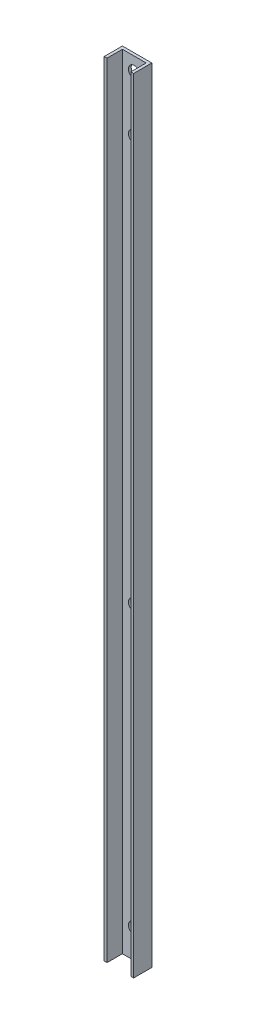
ISO-10303-21;
HEADER;
FILE_DESCRIPTION(('STEP AP214'),'2;1');
FILE_NAME('part.step','',(''),(''),'','','');
FILE_SCHEMA(('AUTOMOTIVE_DESIGN { 1 0 10303 214 1 1 1 1 }'));
ENDSEC;
DATA;
#1=APPLICATION_CONTEXT('core data for automotive mechanical design processes');
#2=APPLICATION_PROTOCOL_DEFINITION('international standard','automotive_design',2000,#1);
#3=PRODUCT_CONTEXT('',#1,'mechanical');
#4=PRODUCT('Part','Part','',(#3));
#5=PRODUCT_RELATED_PRODUCT_CATEGORY('part','',(#4));
#6=PRODUCT_DEFINITION_FORMATION('','',#4);
#7=PRODUCT_DEFINITION_CONTEXT('part definition',#1,'design');
#8=PRODUCT_DEFINITION('design','',#6,#7);
#9=PRODUCT_DEFINITION_SHAPE('','',#8);
#10=(LENGTH_UNIT() NAMED_UNIT(*) SI_UNIT(.MILLI.,.METRE.));
#11=(NAMED_UNIT(*) PLANE_ANGLE_UNIT() SI_UNIT($,.RADIAN.));
#12=(NAMED_UNIT(*) SI_UNIT($,.STERADIAN.) SOLID_ANGLE_UNIT());
#13=UNCERTAINTY_MEASURE_WITH_UNIT(LENGTH_MEASURE(1.E-05),#10,'distance_accuracy_value','');
#14=(GEOMETRIC_REPRESENTATION_CONTEXT(3) GLOBAL_UNCERTAINTY_ASSIGNED_CONTEXT((#13)) GLOBAL_UNIT_ASSIGNED_CONTEXT((#10,
#11,#12)) REPRESENTATION_CONTEXT('',''));
#15=CARTESIAN_POINT('',(0.,0.,0.));
#16=DIRECTION('',(0.,0.,1.));
#17=DIRECTION('',(1.,0.,0.));
#18=AXIS2_PLACEMENT_3D('',#15,#16,#17);
#19=CARTESIAN_POINT('',(6.03004291845494,280.,-4.68669527896996));
#20=DIRECTION('',(1.,0.,0.));
#21=DIRECTION('',(0.,0.,-1.));
#22=AXIS2_PLACEMENT_3D('',#19,#20,#21);
#23=PLANE('',#22);
#24=DIRECTION('',(0.,0.,1.));
#25=VECTOR('',#24,1.);
#26=CARTESIAN_POINT('',(6.03004291845494,0.,-4.68669527896996));
#27=LINE('',#26,#25);
#28=CARTESIAN_POINT('',(6.03004291845494,0.,-3.68669527896996));
#29=VERTEX_POINT('',#28);
#30=CARTESIAN_POINT('',(6.03004291845494,0.,1.81330472103004));
#31=VERTEX_POINT('',#30);
#32=EDGE_CURVE('E132',#29,#31,#27,.T.);
#33=ORIENTED_EDGE('',*,*,#32,.T.);
#34=DIRECTION('',(0.,-1.,0.));
#35=VECTOR('',#34,1.);
#36=CARTESIAN_POINT('',(6.03004291845494,280.,1.81330472103004));
#37=LINE('',#36,#35);
#38=CARTESIAN_POINT('',(6.03004291845494,280.,1.81330472103004));
#39=VERTEX_POINT('',#38);
#40=EDGE_CURVE('E11',#39,#31,#37,.T.);
#41=ORIENTED_EDGE('',*,*,#40,.F.);
#42=DIRECTION('',(0.,0.,1.));
#43=VECTOR('',#42,1.);
#44=CARTESIAN_POINT('',(6.03004291845494,280.,-4.68669527896996));
#45=LINE('',#44,#43);
#46=CARTESIAN_POINT('',(6.03004291845494,280.,-3.68669527896996));
#47=VERTEX_POINT('',#46);
#48=EDGE_CURVE('E90',#47,#39,#45,.T.);
#49=ORIENTED_EDGE('',*,*,#48,.F.);
#50=DIRECTION('',(0.,-1.,0.));
#51=VECTOR('',#50,1.);
#52=CARTESIAN_POINT('',(6.03004291845494,280.,-3.68669527896996));
#53=LINE('',#52,#51);
#54=EDGE_CURVE('E131',#47,#29,#53,.T.);
#55=ORIENTED_EDGE('',*,*,#54,.T.);
#56=EDGE_LOOP('',(#33,#41,#49,#55));
#57=FACE_BOUND('',#56,.T.);
#58=ADVANCED_FACE('F33',(#57),#23,.F.);
#59=CARTESIAN_POINT('',(7.03004291845494,280.,1.81330472103004));
#60=DIRECTION('',(0.,0.,1.));
#61=DIRECTION('',(1.,0.,0.));
#62=AXIS2_PLACEMENT_3D('',#59,#60,#61);
#63=PLANE('',#62);
#64=DIRECTION('',(-1.,0.,0.));
#65=VECTOR('',#64,1.);
#66=CARTESIAN_POINT('',(7.03004291845494,0.,1.81330472103004));
#67=LINE('',#66,#65);
#68=CARTESIAN_POINT('',(7.03004291845494,0.,1.81330472103004));
#69=VERTEX_POINT('',#68);
#70=EDGE_CURVE('E135',#69,#31,#67,.T.);
#71=ORIENTED_EDGE('',*,*,#70,.F.);
#72=DIRECTION('',(0.,-1.,0.));
#73=VECTOR('',#72,1.);
#74=CARTESIAN_POINT('',(7.03004291845494,280.,1.81330472103004));
#75=LINE('',#74,#73);
#76=CARTESIAN_POINT('',(7.03004291845494,280.,1.81330472103004));
#77=VERTEX_POINT('',#76);
#78=EDGE_CURVE('E42',#77,#69,#75,.T.);
#79=ORIENTED_EDGE('',*,*,#78,.F.);
#80=DIRECTION('',(-1.,0.,0.));
#81=VECTOR('',#80,1.);
#82=CARTESIAN_POINT('',(7.03004291845494,280.,1.81330472103004));
#83=LINE('',#82,#81);
#84=EDGE_CURVE('E183',#77,#39,#83,.T.);
#85=ORIENTED_EDGE('',*,*,#84,.T.);
#86=ORIENTED_EDGE('',*,*,#40,.T.);
#87=EDGE_LOOP('',(#71,#79,#85,#86));
#88=FACE_BOUND('',#87,.T.);
#89=ADVANCED_FACE('F216',(#88),#63,.T.);
#90=CARTESIAN_POINT('',(7.03004291845494,280.,-4.68669527896996));
#91=DIRECTION('',(1.,0.,0.));
#92=DIRECTION('',(0.,0.,-1.));
#93=AXIS2_PLACEMENT_3D('',#90,#91,#92);
#94=PLANE('',#93);
#95=DIRECTION('',(0.,0.,1.));
#96=VECTOR('',#95,1.);
#97=CARTESIAN_POINT('',(7.03004291845494,0.,-4.68669527896996));
#98=LINE('',#97,#96);
#99=CARTESIAN_POINT('',(7.03004291845494,0.,-4.68669527896996));
#100=VERTEX_POINT('',#99);
#101=EDGE_CURVE('E139',#100,#69,#98,.T.);
#102=ORIENTED_EDGE('',*,*,#101,.F.);
#103=DIRECTION('',(0.,-1.,0.));
#104=VECTOR('',#103,1.);
#105=CARTESIAN_POINT('',(7.03004291845494,280.,-4.68669527896996));
#106=LINE('',#105,#104);
#107=CARTESIAN_POINT('',(7.03004291845494,280.,-4.68669527896996));
#108=VERTEX_POINT('',#107);
#109=EDGE_CURVE('E156',#108,#100,#106,.T.);
#110=ORIENTED_EDGE('',*,*,#109,.F.);
#111=DIRECTION('',(0.,0.,1.));
#112=VECTOR('',#111,1.);
#113=CARTESIAN_POINT('',(7.03004291845494,280.,-4.68669527896996));
#114=LINE('',#113,#112);
#115=EDGE_CURVE('E186',#108,#77,#114,.T.);
#116=ORIENTED_EDGE('',*,*,#115,.T.);
#117=ORIENTED_EDGE('',*,*,#78,.T.);
#118=EDGE_LOOP('',(#102,#110,#116,#117));
#119=FACE_BOUND('',#118,.T.);
#120=ADVANCED_FACE('F220',(#119),#94,.T.);
#121=CARTESIAN_POINT('',(-3.46995708154506,280.,-4.68669527896996));
#122=DIRECTION('',(0.,0.,-1.));
#123=DIRECTION('',(-1.,0.,0.));
#124=AXIS2_PLACEMENT_3D('',#121,#122,#123);
#125=PLANE('',#124);
#126=CARTESIAN_POINT('',(1.78004291845504,9.99999999999993,-4.68669527896996));
#127=DIRECTION('',(0.,0.,-1.));
#128=DIRECTION('',(-1.,0.,0.));
#129=AXIS2_PLACEMENT_3D('',#126,#127,#128);
#130=CIRCLE('',#129,2.1);
#131=CARTESIAN_POINT('',(-0.319957081544957,9.99999999999993,-4.68669527896996));
#132=VERTEX_POINT('',#131);
#133=EDGE_CURVE('E177',#132,#132,#130,.T.);
#134=ORIENTED_EDGE('',*,*,#133,.F.);
#135=EDGE_LOOP('',(#134));
#136=FACE_BOUND('',#135,.T.);
#137=CARTESIAN_POINT('',(1.78004291845503,110.,-4.68669527896996));
#138=DIRECTION('',(0.,0.,-1.));
#139=DIRECTION('',(-1.,0.,0.));
#140=AXIS2_PLACEMENT_3D('',#137,#138,#139);
#141=CIRCLE('',#140,2.1);
#142=CARTESIAN_POINT('',(-0.319957081544972,110.,-4.68669527896996));
#143=VERTEX_POINT('',#142);
#144=EDGE_CURVE('E167',#143,#143,#141,.T.);
#145=ORIENTED_EDGE('',*,*,#144,.F.);
#146=EDGE_LOOP('',(#145));
#147=FACE_BOUND('',#146,.T.);
#148=CARTESIAN_POINT('',(1.780042918455,255.,-4.68669527896996));
#149=DIRECTION('',(0.,0.,-1.));
#150=DIRECTION('',(-1.,0.,0.));
#151=AXIS2_PLACEMENT_3D('',#148,#149,#150);
#152=CIRCLE('',#151,2.1);
#153=CARTESIAN_POINT('',(-0.319957081545003,255.,-4.68669527896996));
#154=VERTEX_POINT('',#153);
#155=EDGE_CURVE('E164',#154,#154,#152,.T.);
#156=ORIENTED_EDGE('',*,*,#155,.F.);
#157=EDGE_LOOP('',(#156));
#158=FACE_BOUND('',#157,.T.);
#159=CARTESIAN_POINT('',(1.780042918455,275.,-4.68669527896996));
#160=DIRECTION('',(0.,0.,-1.));
#161=DIRECTION('',(-1.,0.,0.));
#162=AXIS2_PLACEMENT_3D('',#159,#160,#161);
#163=CIRCLE('',#162,2.1);
#164=CARTESIAN_POINT('',(-0.319957081545003,275.,-4.68669527896996));
#165=VERTEX_POINT('',#164);
#166=EDGE_CURVE('E161',#165,#165,#163,.T.);
#167=ORIENTED_EDGE('',*,*,#166,.F.);
#168=EDGE_LOOP('',(#167));
#169=FACE_BOUND('',#168,.T.);
#170=DIRECTION('',(1.,0.,0.));
#171=VECTOR('',#170,1.);
#172=CARTESIAN_POINT('',(-3.46995708154506,0.,-4.68669527896996));
#173=LINE('',#172,#171);
#174=CARTESIAN_POINT('',(-3.46995708154506,0.,-4.68669527896996));
#175=VERTEX_POINT('',#174);
#176=EDGE_CURVE('E142',#175,#100,#173,.T.);
#177=ORIENTED_EDGE('',*,*,#176,.F.);
#178=DIRECTION('',(0.,-1.,0.));
#179=VECTOR('',#178,1.);
#180=CARTESIAN_POINT('',(-3.46995708154506,280.,-4.68669527896996));
#181=LINE('',#180,#179);
#182=CARTESIAN_POINT('',(-3.46995708154506,280.,-4.68669527896996));
#183=VERTEX_POINT('',#182);
#184=EDGE_CURVE('E154',#183,#175,#181,.T.);
#185=ORIENTED_EDGE('',*,*,#184,.F.);
#186=DIRECTION('',(1.,0.,0.));
#187=VECTOR('',#186,1.);
#188=CARTESIAN_POINT('',(-3.46995708154506,280.,-4.68669527896996));
#189=LINE('',#188,#187);
#190=EDGE_CURVE('E126',#183,#108,#189,.T.);
#191=ORIENTED_EDGE('',*,*,#190,.T.);
#192=ORIENTED_EDGE('',*,*,#109,.T.);
#193=EDGE_LOOP('',(#177,#185,#191,#192));
#194=FACE_BOUND('',#193,.T.);
#195=ADVANCED_FACE('F191',(#136,#147,#158,#169,#194),#125,.T.);
#196=CARTESIAN_POINT('',(-3.46995708154506,280.,1.81330472103004));
#197=DIRECTION('',(-1.,0.,0.));
#198=DIRECTION('',(0.,0.,1.));
#199=AXIS2_PLACEMENT_3D('',#196,#197,#198);
#200=PLANE('',#199);
#201=DIRECTION('',(0.,0.,-1.));
#202=VECTOR('',#201,1.);
#203=CARTESIAN_POINT('',(-3.46995708154506,0.,1.81330472103004));
#204=LINE('',#203,#202);
#205=CARTESIAN_POINT('',(-3.46995708154506,0.,1.81330472103004));
#206=VERTEX_POINT('',#205);
#207=EDGE_CURVE('E145',#206,#175,#204,.T.);
#208=ORIENTED_EDGE('',*,*,#207,.F.);
#209=DIRECTION('',(0.,-1.,0.));
#210=VECTOR('',#209,1.);
#211=CARTESIAN_POINT('',(-3.46995708154506,280.,1.81330472103004));
#212=LINE('',#211,#210);
#213=CARTESIAN_POINT('',(-3.46995708154506,280.,1.81330472103004));
#214=VERTEX_POINT('',#213);
#215=EDGE_CURVE('E114',#214,#206,#212,.T.);
#216=ORIENTED_EDGE('',*,*,#215,.F.);
#217=DIRECTION('',(0.,0.,-1.));
#218=VECTOR('',#217,1.);
#219=CARTESIAN_POINT('',(-3.46995708154506,280.,1.81330472103004));
#220=LINE('',#219,#218);
#221=EDGE_CURVE('E124',#214,#183,#220,.T.);
#222=ORIENTED_EDGE('',*,*,#221,.T.);
#223=ORIENTED_EDGE('',*,*,#184,.T.);
#224=EDGE_LOOP('',(#208,#216,#222,#223));
#225=FACE_BOUND('',#224,.T.);
#226=ADVANCED_FACE('F196',(#225),#200,.T.);
#227=CARTESIAN_POINT('',(-2.46995708154506,280.,1.81330472103004));
#228=DIRECTION('',(0.,0.,1.));
#229=DIRECTION('',(1.,0.,0.));
#230=AXIS2_PLACEMENT_3D('',#227,#228,#229);
#231=PLANE('',#230);
#232=DIRECTION('',(-1.,0.,0.));
#233=VECTOR('',#232,1.);
#234=CARTESIAN_POINT('',(-2.46995708154506,0.,1.81330472103004));
#235=LINE('',#234,#233);
#236=CARTESIAN_POINT('',(-2.46995708154506,0.,1.81330472103004));
#237=VERTEX_POINT('',#236);
#238=EDGE_CURVE('E113',#237,#206,#235,.T.);
#239=ORIENTED_EDGE('',*,*,#238,.F.);
#240=DIRECTION('',(0.,-1.,0.));
#241=VECTOR('',#240,1.);
#242=CARTESIAN_POINT('',(-2.46995708154506,280.,1.81330472103004));
#243=LINE('',#242,#241);
#244=CARTESIAN_POINT('',(-2.46995708154506,280.,1.81330472103004));
#245=VERTEX_POINT('',#244);
#246=EDGE_CURVE('E107',#245,#237,#243,.T.);
#247=ORIENTED_EDGE('',*,*,#246,.F.);
#248=DIRECTION('',(-1.,0.,0.));
#249=VECTOR('',#248,1.);
#250=CARTESIAN_POINT('',(-2.46995708154506,280.,1.81330472103004));
#251=LINE('',#250,#249);
#252=EDGE_CURVE('E111',#245,#214,#251,.T.);
#253=ORIENTED_EDGE('',*,*,#252,.T.);
#254=ORIENTED_EDGE('',*,*,#215,.T.);
#255=EDGE_LOOP('',(#239,#247,#253,#254));
#256=FACE_BOUND('',#255,.T.);
#257=ADVANCED_FACE('F109',(#256),#231,.T.);
#258=CARTESIAN_POINT('',(-2.46995708154506,280.,1.81330472103004));
#259=DIRECTION('',(-1.,0.,0.));
#260=DIRECTION('',(0.,0.,1.));
#261=AXIS2_PLACEMENT_3D('',#258,#259,#260);
#262=PLANE('',#261);
#263=DIRECTION('',(0.,0.,-1.));
#264=VECTOR('',#263,1.);
#265=CARTESIAN_POINT('',(-2.46995708154506,0.,1.81330472103004));
#266=LINE('',#265,#264);
#267=CARTESIAN_POINT('',(-2.46995708154506,0.,-3.68669527896996));
#268=VERTEX_POINT('',#267);
#269=EDGE_CURVE('E78',#237,#268,#266,.T.);
#270=ORIENTED_EDGE('',*,*,#269,.T.);
#271=DIRECTION('',(0.,-1.,0.));
#272=VECTOR('',#271,1.);
#273=CARTESIAN_POINT('',(-2.46995708154506,280.,-3.68669527896996));
#274=LINE('',#273,#272);
#275=CARTESIAN_POINT('',(-2.46995708154506,280.,-3.68669527896996));
#276=VERTEX_POINT('',#275);
#277=EDGE_CURVE('E115',#276,#268,#274,.T.);
#278=ORIENTED_EDGE('',*,*,#277,.F.);
#279=DIRECTION('',(0.,0.,-1.));
#280=VECTOR('',#279,1.);
#281=CARTESIAN_POINT('',(-2.46995708154506,280.,1.81330472103004));
#282=LINE('',#281,#280);
#283=EDGE_CURVE('E117',#245,#276,#282,.T.);
#284=ORIENTED_EDGE('',*,*,#283,.F.);
#285=ORIENTED_EDGE('',*,*,#246,.T.);
#286=EDGE_LOOP('',(#270,#278,#284,#285));
#287=FACE_BOUND('',#286,.T.);
#288=ADVANCED_FACE('F118',(#287),#262,.F.);
#289=CARTESIAN_POINT('',(-3.46995708154506,280.,-3.68669527896996));
#290=DIRECTION('',(0.,0.,-1.));
#291=DIRECTION('',(-1.,0.,0.));
#292=AXIS2_PLACEMENT_3D('',#289,#290,#291);
#293=PLANE('',#292);
#294=CARTESIAN_POINT('',(1.78004291845504,9.99999999999993,-3.68669527896996));
#295=DIRECTION('',(0.,0.,-1.));
#296=DIRECTION('',(-1.,0.,0.));
#297=AXIS2_PLACEMENT_3D('',#294,#295,#296);
#298=CIRCLE('',#297,2.1);
#299=CARTESIAN_POINT('',(-0.319957081544957,9.99999999999993,-3.68669527896996));
#300=VERTEX_POINT('',#299);
#301=EDGE_CURVE('E36',#300,#300,#298,.T.);
#302=ORIENTED_EDGE('',*,*,#301,.T.);
#303=EDGE_LOOP('',(#302));
#304=FACE_BOUND('',#303,.T.);
#305=CARTESIAN_POINT('',(1.78004291845503,110.,-3.68669527896996));
#306=DIRECTION('',(0.,0.,-1.));
#307=DIRECTION('',(-1.,0.,0.));
#308=AXIS2_PLACEMENT_3D('',#305,#306,#307);
#309=CIRCLE('',#308,2.1);
#310=CARTESIAN_POINT('',(-0.319957081544972,110.,-3.68669527896996));
#311=VERTEX_POINT('',#310);
#312=EDGE_CURVE('E165',#311,#311,#309,.T.);
#313=ORIENTED_EDGE('',*,*,#312,.T.);
#314=EDGE_LOOP('',(#313));
#315=FACE_BOUND('',#314,.T.);
#316=CARTESIAN_POINT('',(1.780042918455,255.,-3.68669527896996));
#317=DIRECTION('',(0.,0.,-1.));
#318=DIRECTION('',(-1.,0.,0.));
#319=AXIS2_PLACEMENT_3D('',#316,#317,#318);
#320=CIRCLE('',#319,2.1);
#321=CARTESIAN_POINT('',(-0.319957081545003,255.,-3.68669527896996));
#322=VERTEX_POINT('',#321);
#323=EDGE_CURVE('E162',#322,#322,#320,.T.);
#324=ORIENTED_EDGE('',*,*,#323,.T.);
#325=EDGE_LOOP('',(#324));
#326=FACE_BOUND('',#325,.T.);
#327=CARTESIAN_POINT('',(1.780042918455,275.,-3.68669527896996));
#328=DIRECTION('',(0.,0.,-1.));
#329=DIRECTION('',(-1.,0.,0.));
#330=AXIS2_PLACEMENT_3D('',#327,#328,#329);
#331=CIRCLE('',#330,2.1);
#332=CARTESIAN_POINT('',(-0.319957081545003,275.,-3.68669527896996));
#333=VERTEX_POINT('',#332);
#334=EDGE_CURVE('E136',#333,#333,#331,.T.);
#335=ORIENTED_EDGE('',*,*,#334,.T.);
#336=EDGE_LOOP('',(#335));
#337=FACE_BOUND('',#336,.T.);
#338=DIRECTION('',(1.,0.,0.));
#339=VECTOR('',#338,1.);
#340=CARTESIAN_POINT('',(-3.46995708154506,0.,-3.68669527896996));
#341=LINE('',#340,#339);
#342=EDGE_CURVE('E84',#268,#29,#341,.T.);
#343=ORIENTED_EDGE('',*,*,#342,.T.);
#344=ORIENTED_EDGE('',*,*,#54,.F.);
#345=DIRECTION('',(1.,0.,0.));
#346=VECTOR('',#345,1.);
#347=CARTESIAN_POINT('',(-3.46995708154506,280.,-3.68669527896996));
#348=LINE('',#347,#346);
#349=EDGE_CURVE('E51',#276,#47,#348,.T.);
#350=ORIENTED_EDGE('',*,*,#349,.F.);
#351=ORIENTED_EDGE('',*,*,#277,.T.);
#352=EDGE_LOOP('',(#343,#344,#350,#351));
#353=FACE_BOUND('',#352,.T.);
#354=ADVANCED_FACE('F202',(#304,#315,#326,#337,#353),#293,.F.);
#355=CARTESIAN_POINT('',(0.,280.,0.));
#356=DIRECTION('',(0.,-1.,0.));
#357=DIRECTION('',(-1.,0.,0.));
#358=AXIS2_PLACEMENT_3D('',#355,#356,#357);
#359=PLANE('',#358);
#360=ORIENTED_EDGE('',*,*,#48,.T.);
#361=ORIENTED_EDGE('',*,*,#84,.F.);
#362=ORIENTED_EDGE('',*,*,#115,.F.);
#363=ORIENTED_EDGE('',*,*,#190,.F.);
#364=ORIENTED_EDGE('',*,*,#221,.F.);
#365=ORIENTED_EDGE('',*,*,#252,.F.);
#366=ORIENTED_EDGE('',*,*,#283,.T.);
#367=ORIENTED_EDGE('',*,*,#349,.T.);
#368=EDGE_LOOP('',(#360,#361,#362,#363,#364,#365,#366,#367));
#369=FACE_BOUND('',#368,.T.);
#370=ADVANCED_FACE('F121',(#369),#359,.F.);
#371=CARTESIAN_POINT('',(0.,0.,0.));
#372=DIRECTION('',(0.,-1.,0.));
#373=DIRECTION('',(-1.,0.,0.));
#374=AXIS2_PLACEMENT_3D('',#371,#372,#373);
#375=PLANE('',#374);
#376=ORIENTED_EDGE('',*,*,#32,.F.);
#377=ORIENTED_EDGE('',*,*,#342,.F.);
#378=ORIENTED_EDGE('',*,*,#269,.F.);
#379=ORIENTED_EDGE('',*,*,#238,.T.);
#380=ORIENTED_EDGE('',*,*,#207,.T.);
#381=ORIENTED_EDGE('',*,*,#176,.T.);
#382=ORIENTED_EDGE('',*,*,#101,.T.);
#383=ORIENTED_EDGE('',*,*,#70,.T.);
#384=EDGE_LOOP('',(#376,#377,#378,#379,#380,#381,#382,#383));
#385=FACE_BOUND('',#384,.T.);
#386=ADVANCED_FACE('F199',(#385),#375,.T.);
#387=CARTESIAN_POINT('',(1.780042918455,275.,5.31330472103004));
#388=DIRECTION('',(0.,0.,-1.));
#389=DIRECTION('',(-1.,0.,0.));
#390=AXIS2_PLACEMENT_3D('',#387,#388,#389);
#391=CYLINDRICAL_SURFACE('',#390,2.1);
#392=ORIENTED_EDGE('',*,*,#166,.T.);
#393=EDGE_LOOP('',(#392));
#394=FACE_BOUND('',#393,.T.);
#395=ORIENTED_EDGE('',*,*,#334,.F.);
#396=EDGE_LOOP('',(#395));
#397=FACE_BOUND('',#396,.T.);
#398=ADVANCED_FACE('F256',(#394,#397),#391,.F.);
#399=CARTESIAN_POINT('',(1.780042918455,255.,5.31330472103004));
#400=DIRECTION('',(0.,0.,-1.));
#401=DIRECTION('',(-1.,0.,0.));
#402=AXIS2_PLACEMENT_3D('',#399,#400,#401);
#403=CYLINDRICAL_SURFACE('',#402,2.1);
#404=ORIENTED_EDGE('',*,*,#155,.T.);
#405=EDGE_LOOP('',(#404));
#406=FACE_BOUND('',#405,.T.);
#407=ORIENTED_EDGE('',*,*,#323,.F.);
#408=EDGE_LOOP('',(#407));
#409=FACE_BOUND('',#408,.T.);
#410=ADVANCED_FACE('F261',(#406,#409),#403,.F.);
#411=CARTESIAN_POINT('',(1.78004291845503,110.,5.31330472103004));
#412=DIRECTION('',(0.,0.,-1.));
#413=DIRECTION('',(-1.,0.,0.));
#414=AXIS2_PLACEMENT_3D('',#411,#412,#413);
#415=CYLINDRICAL_SURFACE('',#414,2.1);
#416=ORIENTED_EDGE('',*,*,#144,.T.);
#417=EDGE_LOOP('',(#416));
#418=FACE_BOUND('',#417,.T.);
#419=ORIENTED_EDGE('',*,*,#312,.F.);
#420=EDGE_LOOP('',(#419));
#421=FACE_BOUND('',#420,.T.);
#422=ADVANCED_FACE('F269',(#418,#421),#415,.F.);
#423=CARTESIAN_POINT('',(1.78004291845504,9.99999999999993,5.31330472103004));
#424=DIRECTION('',(0.,0.,-1.));
#425=DIRECTION('',(-1.,0.,0.));
#426=AXIS2_PLACEMENT_3D('',#423,#424,#425);
#427=CYLINDRICAL_SURFACE('',#426,2.1);
#428=ORIENTED_EDGE('',*,*,#133,.T.);
#429=EDGE_LOOP('',(#428));
#430=FACE_BOUND('',#429,.T.);
#431=ORIENTED_EDGE('',*,*,#301,.F.);
#432=EDGE_LOOP('',(#431));
#433=FACE_BOUND('',#432,.T.);
#434=ADVANCED_FACE('F277',(#430,#433),#427,.F.);
#435=CLOSED_SHELL('',(#58,#89,#120,#195,#226,#257,#288,#354,#370,#386,#398,#410,#422,#434));
#436=MANIFOLD_SOLID_BREP('B2',#435);
#437=ADVANCED_BREP_SHAPE_REPRESENTATION('',(#18,#436),#14);
#438=SHAPE_DEFINITION_REPRESENTATION(#9,#437);
ENDSEC;
END-ISO-10303-21;
